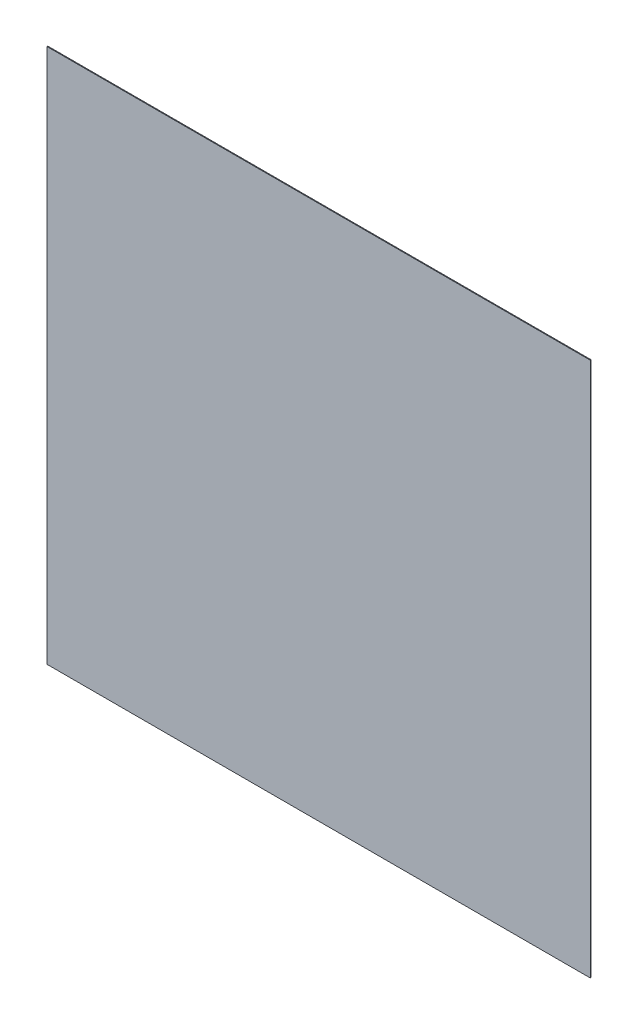
ISO-10303-21;
HEADER;
FILE_DESCRIPTION(('STEP AP214'),'2;1');
FILE_NAME('part.step','',(''),(''),'','','');
FILE_SCHEMA(('AUTOMOTIVE_DESIGN { 1 0 10303 214 1 1 1 1 }'));
ENDSEC;
DATA;
#1=APPLICATION_CONTEXT('core data for automotive mechanical design processes');
#2=APPLICATION_PROTOCOL_DEFINITION('international standard','automotive_design',2000,#1);
#3=PRODUCT_CONTEXT('',#1,'mechanical');
#4=PRODUCT('Part','Part','',(#3));
#5=PRODUCT_RELATED_PRODUCT_CATEGORY('part','',(#4));
#6=PRODUCT_DEFINITION_FORMATION('','',#4);
#7=PRODUCT_DEFINITION_CONTEXT('part definition',#1,'design');
#8=PRODUCT_DEFINITION('design','',#6,#7);
#9=PRODUCT_DEFINITION_SHAPE('','',#8);
#10=(LENGTH_UNIT() NAMED_UNIT(*) SI_UNIT(.MILLI.,.METRE.));
#11=(NAMED_UNIT(*) PLANE_ANGLE_UNIT() SI_UNIT($,.RADIAN.));
#12=(NAMED_UNIT(*) SI_UNIT($,.STERADIAN.) SOLID_ANGLE_UNIT());
#13=UNCERTAINTY_MEASURE_WITH_UNIT(LENGTH_MEASURE(1.E-05),#10,'distance_accuracy_value','');
#14=(GEOMETRIC_REPRESENTATION_CONTEXT(3) GLOBAL_UNCERTAINTY_ASSIGNED_CONTEXT((#13)) GLOBAL_UNIT_ASSIGNED_CONTEXT((#10,
#11,#12)) REPRESENTATION_CONTEXT('',''));
#15=CARTESIAN_POINT('',(0.,0.,0.));
#16=DIRECTION('',(0.,0.,1.));
#17=DIRECTION('',(1.,0.,0.));
#18=AXIS2_PLACEMENT_3D('',#15,#16,#17);
#19=CARTESIAN_POINT('',(650.,640.,1.92));
#20=DIRECTION('',(-1.,0.,0.));
#21=DIRECTION('',(0.,-1.,0.));
#22=AXIS2_PLACEMENT_3D('',#19,#20,#21);
#23=PLANE('',#22);
#24=DIRECTION('',(0.,1.,0.));
#25=VECTOR('',#24,1.);
#26=CARTESIAN_POINT('',(650.,640.,0.));
#27=LINE('',#26,#25);
#28=CARTESIAN_POINT('',(650.,-640.,0.));
#29=VERTEX_POINT('',#28);
#30=CARTESIAN_POINT('',(650.,640.,0.));
#31=VERTEX_POINT('',#30);
#32=EDGE_CURVE('E95',#29,#31,#27,.T.);
#33=ORIENTED_EDGE('',*,*,#32,.T.);
#34=DIRECTION('',(0.,0.,-1.));
#35=VECTOR('',#34,1.);
#36=CARTESIAN_POINT('',(650.,640.,1.92));
#37=LINE('',#36,#35);
#38=CARTESIAN_POINT('',(650.,640.,1.92));
#39=VERTEX_POINT('',#38);
#40=EDGE_CURVE('E11',#39,#31,#37,.T.);
#41=ORIENTED_EDGE('',*,*,#40,.F.);
#42=DIRECTION('',(0.,1.,0.));
#43=VECTOR('',#42,1.);
#44=CARTESIAN_POINT('',(650.,640.,1.92));
#45=LINE('',#44,#43);
#46=CARTESIAN_POINT('',(650.,-640.,1.92));
#47=VERTEX_POINT('',#46);
#48=EDGE_CURVE('E83',#47,#39,#45,.T.);
#49=ORIENTED_EDGE('',*,*,#48,.F.);
#50=DIRECTION('',(0.,0.,-1.));
#51=VECTOR('',#50,1.);
#52=CARTESIAN_POINT('',(650.,-640.,1.92));
#53=LINE('',#52,#51);
#54=EDGE_CURVE('E91',#47,#29,#53,.T.);
#55=ORIENTED_EDGE('',*,*,#54,.T.);
#56=EDGE_LOOP('',(#33,#41,#49,#55));
#57=FACE_BOUND('',#56,.T.);
#58=ADVANCED_FACE('F32',(#57),#23,.F.);
#59=CARTESIAN_POINT('',(-650.,640.,1.92));
#60=DIRECTION('',(0.,-1.,0.));
#61=DIRECTION('',(0.,0.,-1.));
#62=AXIS2_PLACEMENT_3D('',#59,#60,#61);
#63=PLANE('',#62);
#64=DIRECTION('',(-1.,0.,0.));
#65=VECTOR('',#64,1.);
#66=CARTESIAN_POINT('',(-650.,640.,0.));
#67=LINE('',#66,#65);
#68=CARTESIAN_POINT('',(-650.,640.,0.));
#69=VERTEX_POINT('',#68);
#70=EDGE_CURVE('E87',#31,#69,#67,.T.);
#71=ORIENTED_EDGE('',*,*,#70,.T.);
#72=DIRECTION('',(0.,0.,-1.));
#73=VECTOR('',#72,1.);
#74=CARTESIAN_POINT('',(-650.,640.,1.92));
#75=LINE('',#74,#73);
#76=CARTESIAN_POINT('',(-650.,640.,1.92));
#77=VERTEX_POINT('',#76);
#78=EDGE_CURVE('E40',#77,#69,#75,.T.);
#79=ORIENTED_EDGE('',*,*,#78,.F.);
#80=DIRECTION('',(-1.,0.,0.));
#81=VECTOR('',#80,1.);
#82=CARTESIAN_POINT('',(-650.,640.,1.92));
#83=LINE('',#82,#81);
#84=EDGE_CURVE('E78',#39,#77,#83,.T.);
#85=ORIENTED_EDGE('',*,*,#84,.F.);
#86=ORIENTED_EDGE('',*,*,#40,.T.);
#87=EDGE_LOOP('',(#71,#79,#85,#86));
#88=FACE_BOUND('',#87,.T.);
#89=ADVANCED_FACE('F86',(#88),#63,.F.);
#90=CARTESIAN_POINT('',(-650.,640.,1.92));
#91=DIRECTION('',(1.,0.,0.));
#92=DIRECTION('',(0.,0.,-1.));
#93=AXIS2_PLACEMENT_3D('',#90,#91,#92);
#94=PLANE('',#93);
#95=DIRECTION('',(0.,-1.,0.));
#96=VECTOR('',#95,1.);
#97=CARTESIAN_POINT('',(-650.,640.,0.));
#98=LINE('',#97,#96);
#99=CARTESIAN_POINT('',(-650.,-640.,0.));
#100=VERTEX_POINT('',#99);
#101=EDGE_CURVE('E65',#69,#100,#98,.T.);
#102=ORIENTED_EDGE('',*,*,#101,.T.);
#103=DIRECTION('',(0.,0.,-1.));
#104=VECTOR('',#103,1.);
#105=CARTESIAN_POINT('',(-650.,-640.,1.92));
#106=LINE('',#105,#104);
#107=CARTESIAN_POINT('',(-650.,-640.,1.92));
#108=VERTEX_POINT('',#107);
#109=EDGE_CURVE('E88',#108,#100,#106,.T.);
#110=ORIENTED_EDGE('',*,*,#109,.F.);
#111=DIRECTION('',(0.,-1.,0.));
#112=VECTOR('',#111,1.);
#113=CARTESIAN_POINT('',(-650.,640.,1.92));
#114=LINE('',#113,#112);
#115=EDGE_CURVE('E81',#77,#108,#114,.T.);
#116=ORIENTED_EDGE('',*,*,#115,.F.);
#117=ORIENTED_EDGE('',*,*,#78,.T.);
#118=EDGE_LOOP('',(#102,#110,#116,#117));
#119=FACE_BOUND('',#118,.T.);
#120=ADVANCED_FACE('F89',(#119),#94,.F.);
#121=CARTESIAN_POINT('',(-650.,-640.,1.92));
#122=DIRECTION('',(0.,1.,0.));
#123=DIRECTION('',(0.,0.,1.));
#124=AXIS2_PLACEMENT_3D('',#121,#122,#123);
#125=PLANE('',#124);
#126=DIRECTION('',(1.,0.,0.));
#127=VECTOR('',#126,1.);
#128=CARTESIAN_POINT('',(-650.,-640.,0.));
#129=LINE('',#128,#127);
#130=EDGE_CURVE('E71',#100,#29,#129,.T.);
#131=ORIENTED_EDGE('',*,*,#130,.T.);
#132=ORIENTED_EDGE('',*,*,#54,.F.);
#133=DIRECTION('',(1.,0.,0.));
#134=VECTOR('',#133,1.);
#135=CARTESIAN_POINT('',(-650.,-640.,1.92));
#136=LINE('',#135,#134);
#137=EDGE_CURVE('E48',#108,#47,#136,.T.);
#138=ORIENTED_EDGE('',*,*,#137,.F.);
#139=ORIENTED_EDGE('',*,*,#109,.T.);
#140=EDGE_LOOP('',(#131,#132,#138,#139));
#141=FACE_BOUND('',#140,.T.);
#142=ADVANCED_FACE('F102',(#141),#125,.F.);
#143=CARTESIAN_POINT('',(0.,0.,1.92));
#144=DIRECTION('',(0.,0.,1.));
#145=DIRECTION('',(1.,0.,0.));
#146=AXIS2_PLACEMENT_3D('',#143,#144,#145);
#147=PLANE('',#146);
#148=ORIENTED_EDGE('',*,*,#48,.T.);
#149=ORIENTED_EDGE('',*,*,#84,.T.);
#150=ORIENTED_EDGE('',*,*,#115,.T.);
#151=ORIENTED_EDGE('',*,*,#137,.T.);
#152=EDGE_LOOP('',(#148,#149,#150,#151));
#153=FACE_BOUND('',#152,.T.);
#154=ADVANCED_FACE('F79',(#153),#147,.T.);
#155=CARTESIAN_POINT('',(0.,0.,0.));
#156=DIRECTION('',(0.,0.,1.));
#157=DIRECTION('',(1.,0.,0.));
#158=AXIS2_PLACEMENT_3D('',#155,#156,#157);
#159=PLANE('',#158);
#160=ORIENTED_EDGE('',*,*,#32,.F.);
#161=ORIENTED_EDGE('',*,*,#130,.F.);
#162=ORIENTED_EDGE('',*,*,#101,.F.);
#163=ORIENTED_EDGE('',*,*,#70,.F.);
#164=EDGE_LOOP('',(#160,#161,#162,#163));
#165=FACE_BOUND('',#164,.T.);
#166=ADVANCED_FACE('F105',(#165),#159,.F.);
#167=CLOSED_SHELL('',(#58,#89,#120,#142,#154,#166));
#168=MANIFOLD_SOLID_BREP('B2',#167);
#169=ADVANCED_BREP_SHAPE_REPRESENTATION('',(#18,#168),#14);
#170=SHAPE_DEFINITION_REPRESENTATION(#9,#169);
ENDSEC;
END-ISO-10303-21;
